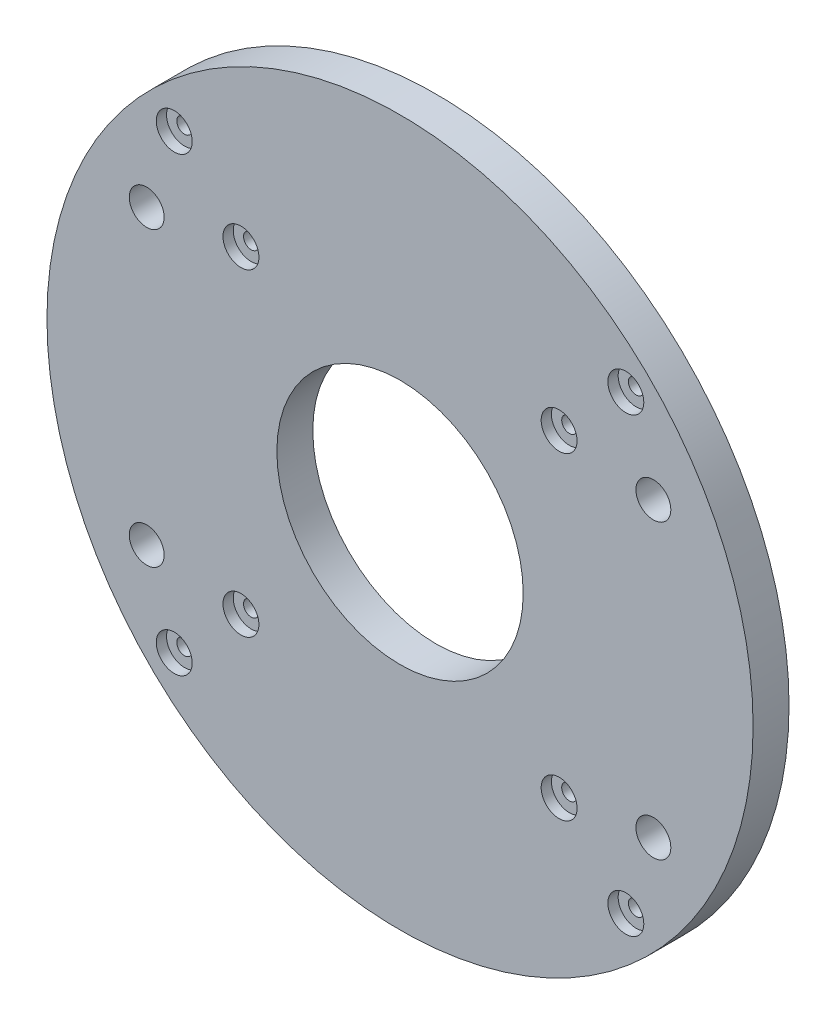
ISO-10303-21;
HEADER;
FILE_DESCRIPTION(('STEP AP214'),'2;1');
FILE_NAME('part.step','',(''),(''),'','','');
FILE_SCHEMA(('AUTOMOTIVE_DESIGN { 1 0 10303 214 1 1 1 1 }'));
ENDSEC;
DATA;
#1=APPLICATION_CONTEXT('core data for automotive mechanical design processes');
#2=APPLICATION_PROTOCOL_DEFINITION('international standard','automotive_design',2000,#1);
#3=PRODUCT_CONTEXT('',#1,'mechanical');
#4=PRODUCT('Part','Part','',(#3));
#5=PRODUCT_RELATED_PRODUCT_CATEGORY('part','',(#4));
#6=PRODUCT_DEFINITION_FORMATION('','',#4);
#7=PRODUCT_DEFINITION_CONTEXT('part definition',#1,'design');
#8=PRODUCT_DEFINITION('design','',#6,#7);
#9=PRODUCT_DEFINITION_SHAPE('','',#8);
#10=(LENGTH_UNIT() NAMED_UNIT(*) SI_UNIT(.MILLI.,.METRE.));
#11=(NAMED_UNIT(*) PLANE_ANGLE_UNIT() SI_UNIT($,.RADIAN.));
#12=(NAMED_UNIT(*) SI_UNIT($,.STERADIAN.) SOLID_ANGLE_UNIT());
#13=UNCERTAINTY_MEASURE_WITH_UNIT(LENGTH_MEASURE(1.E-05),#10,'distance_accuracy_value','');
#14=(GEOMETRIC_REPRESENTATION_CONTEXT(3) GLOBAL_UNCERTAINTY_ASSIGNED_CONTEXT((#13)) GLOBAL_UNIT_ASSIGNED_CONTEXT((#10,
#11,#12)) REPRESENTATION_CONTEXT('',''));
#15=CARTESIAN_POINT('',(0.,0.,0.));
#16=DIRECTION('',(0.,0.,1.));
#17=DIRECTION('',(1.,0.,0.));
#18=AXIS2_PLACEMENT_3D('',#15,#16,#17);
#19=CARTESIAN_POINT('',(53.9687161664425,14.353538626856,3.5));
#20=DIRECTION('',(0.,0.,-1.));
#21=DIRECTION('',(-1.,0.,0.));
#22=AXIS2_PLACEMENT_3D('',#19,#20,#21);
#23=CYLINDRICAL_SURFACE('',#22,0.749999999999999);
#24=CARTESIAN_POINT('',(53.9687161664425,14.353538626856,0.));
#25=DIRECTION('',(0.,0.,1.));
#26=DIRECTION('',(1.,0.,0.));
#27=AXIS2_PLACEMENT_3D('',#24,#25,#26);
#28=CIRCLE('',#27,0.749999999999999);
#29=CARTESIAN_POINT('',(54.7187161664425,14.353538626856,0.));
#30=VERTEX_POINT('',#29);
#31=EDGE_CURVE('E120',#30,#30,#28,.F.);
#32=ORIENTED_EDGE('',*,*,#31,.T.);
#33=EDGE_LOOP('',(#32));
#34=FACE_BOUND('',#33,.T.);
#35=CARTESIAN_POINT('',(53.9687161664425,14.353538626856,2.5));
#36=DIRECTION('',(0.,0.,1.));
#37=DIRECTION('',(1.,0.,0.));
#38=AXIS2_PLACEMENT_3D('',#35,#36,#37);
#39=CIRCLE('',#38,0.749999999999999);
#40=CARTESIAN_POINT('',(54.7187161664425,14.353538626856,2.5));
#41=VERTEX_POINT('',#40);
#42=EDGE_CURVE('E111',#41,#41,#39,.F.);
#43=ORIENTED_EDGE('',*,*,#42,.F.);
#44=EDGE_LOOP('',(#43));
#45=FACE_BOUND('',#44,.T.);
#46=ADVANCED_FACE('F41',(#34,#45),#23,.F.);
#47=CARTESIAN_POINT('',(47.4687161664425,-23.146461373144,3.5));
#48=DIRECTION('',(0.,0.,-1.));
#49=DIRECTION('',(-1.,0.,0.));
#50=AXIS2_PLACEMENT_3D('',#47,#48,#49);
#51=CYLINDRICAL_SURFACE('',#50,0.750000000000023);
#52=CARTESIAN_POINT('',(47.4687161664425,-23.146461373144,0.));
#53=DIRECTION('',(0.,0.,1.));
#54=DIRECTION('',(1.,0.,0.));
#55=AXIS2_PLACEMENT_3D('',#52,#53,#54);
#56=CIRCLE('',#55,0.750000000000023);
#57=CARTESIAN_POINT('',(48.2187161664425,-23.146461373144,0.));
#58=VERTEX_POINT('',#57);
#59=EDGE_CURVE('E145',#58,#58,#56,.T.);
#60=ORIENTED_EDGE('',*,*,#59,.F.);
#61=EDGE_LOOP('',(#60));
#62=FACE_BOUND('',#61,.T.);
#63=CARTESIAN_POINT('',(47.4687161664425,-23.146461373144,2.5));
#64=DIRECTION('',(0.,0.,1.));
#65=DIRECTION('',(1.,0.,0.));
#66=AXIS2_PLACEMENT_3D('',#63,#64,#65);
#67=CIRCLE('',#66,0.750000000000023);
#68=CARTESIAN_POINT('',(48.2187161664425,-23.146461373144,2.5));
#69=VERTEX_POINT('',#68);
#70=EDGE_CURVE('E101',#69,#69,#67,.F.);
#71=ORIENTED_EDGE('',*,*,#70,.F.);
#72=EDGE_LOOP('',(#71));
#73=FACE_BOUND('',#72,.T.);
#74=ADVANCED_FACE('F204',(#62,#73),#51,.F.);
#75=CARTESIAN_POINT('',(53.9687161664425,-29.646461373144,3.5));
#76=DIRECTION('',(0.,0.,-1.));
#77=DIRECTION('',(-1.,0.,0.));
#78=AXIS2_PLACEMENT_3D('',#75,#76,#77);
#79=CYLINDRICAL_SURFACE('',#78,0.750000000000049);
#80=CARTESIAN_POINT('',(53.9687161664425,-29.646461373144,0.));
#81=DIRECTION('',(0.,0.,1.));
#82=DIRECTION('',(1.,0.,0.));
#83=AXIS2_PLACEMENT_3D('',#80,#81,#82);
#84=CIRCLE('',#83,0.750000000000049);
#85=CARTESIAN_POINT('',(54.7187161664426,-29.646461373144,0.));
#86=VERTEX_POINT('',#85);
#87=EDGE_CURVE('E148',#86,#86,#84,.T.);
#88=ORIENTED_EDGE('',*,*,#87,.F.);
#89=EDGE_LOOP('',(#88));
#90=FACE_BOUND('',#89,.T.);
#91=CARTESIAN_POINT('',(53.9687161664425,-29.646461373144,2.5));
#92=DIRECTION('',(0.,0.,1.));
#93=DIRECTION('',(1.,0.,0.));
#94=AXIS2_PLACEMENT_3D('',#91,#92,#93);
#95=CIRCLE('',#94,0.750000000000049);
#96=CARTESIAN_POINT('',(54.7187161664426,-29.646461373144,2.5));
#97=VERTEX_POINT('',#96);
#98=EDGE_CURVE('E119',#97,#97,#95,.F.);
#99=ORIENTED_EDGE('',*,*,#98,.F.);
#100=EDGE_LOOP('',(#99));
#101=FACE_BOUND('',#100,.T.);
#102=ADVANCED_FACE('F361',(#90,#101),#79,.F.);
#103=CARTESIAN_POINT('',(9.96871616644252,-29.646461373144,3.5));
#104=DIRECTION('',(0.,0.,-1.));
#105=DIRECTION('',(-1.,0.,0.));
#106=AXIS2_PLACEMENT_3D('',#103,#104,#105);
#107=CYLINDRICAL_SURFACE('',#106,0.750000000000032);
#108=CARTESIAN_POINT('',(9.96871616644252,-29.646461373144,0.));
#109=DIRECTION('',(0.,0.,1.));
#110=DIRECTION('',(1.,0.,0.));
#111=AXIS2_PLACEMENT_3D('',#108,#109,#110);
#112=CIRCLE('',#111,0.750000000000032);
#113=CARTESIAN_POINT('',(10.7187161664425,-29.646461373144,0.));
#114=VERTEX_POINT('',#113);
#115=EDGE_CURVE('E151',#114,#114,#112,.F.);
#116=ORIENTED_EDGE('',*,*,#115,.T.);
#117=EDGE_LOOP('',(#116));
#118=FACE_BOUND('',#117,.T.);
#119=CARTESIAN_POINT('',(9.96871616644252,-29.646461373144,2.5));
#120=DIRECTION('',(0.,0.,1.));
#121=DIRECTION('',(1.,0.,0.));
#122=AXIS2_PLACEMENT_3D('',#119,#120,#121);
#123=CIRCLE('',#122,0.750000000000032);
#124=CARTESIAN_POINT('',(10.7187161664425,-29.646461373144,2.5));
#125=VERTEX_POINT('',#124);
#126=EDGE_CURVE('E129',#125,#125,#123,.F.);
#127=ORIENTED_EDGE('',*,*,#126,.F.);
#128=EDGE_LOOP('',(#127));
#129=FACE_BOUND('',#128,.T.);
#130=ADVANCED_FACE('F357',(#118,#129),#107,.F.);
#131=CARTESIAN_POINT('',(47.4687161664425,7.85353862685598,3.5));
#132=DIRECTION('',(0.,0.,-1.));
#133=DIRECTION('',(-1.,0.,0.));
#134=AXIS2_PLACEMENT_3D('',#131,#132,#133);
#135=CYLINDRICAL_SURFACE('',#134,0.749999999999999);
#136=CARTESIAN_POINT('',(47.4687161664425,7.85353862685598,0.));
#137=DIRECTION('',(0.,0.,1.));
#138=DIRECTION('',(1.,0.,0.));
#139=AXIS2_PLACEMENT_3D('',#136,#137,#138);
#140=CIRCLE('',#139,0.749999999999999);
#141=CARTESIAN_POINT('',(48.2187161664425,7.85353862685598,0.));
#142=VERTEX_POINT('',#141);
#143=EDGE_CURVE('E154',#142,#142,#140,.F.);
#144=ORIENTED_EDGE('',*,*,#143,.T.);
#145=EDGE_LOOP('',(#144));
#146=FACE_BOUND('',#145,.T.);
#147=CARTESIAN_POINT('',(47.4687161664425,7.85353862685598,2.5));
#148=DIRECTION('',(0.,0.,1.));
#149=DIRECTION('',(1.,0.,0.));
#150=AXIS2_PLACEMENT_3D('',#147,#148,#149);
#151=CIRCLE('',#150,0.749999999999999);
#152=CARTESIAN_POINT('',(48.2187161664425,7.85353862685598,2.5));
#153=VERTEX_POINT('',#152);
#154=EDGE_CURVE('E83',#153,#153,#151,.F.);
#155=ORIENTED_EDGE('',*,*,#154,.F.);
#156=EDGE_LOOP('',(#155));
#157=FACE_BOUND('',#156,.T.);
#158=ADVANCED_FACE('F360',(#146,#157),#135,.F.);
#159=CARTESIAN_POINT('',(9.96871616644252,14.353538626856,3.5));
#160=DIRECTION('',(0.,0.,-1.));
#161=DIRECTION('',(-1.,0.,0.));
#162=AXIS2_PLACEMENT_3D('',#159,#160,#161);
#163=CYLINDRICAL_SURFACE('',#162,0.749999999999975);
#164=CARTESIAN_POINT('',(9.96871616644252,14.353538626856,0.));
#165=DIRECTION('',(0.,0.,1.));
#166=DIRECTION('',(1.,0.,0.));
#167=AXIS2_PLACEMENT_3D('',#164,#165,#166);
#168=CIRCLE('',#167,0.749999999999975);
#169=CARTESIAN_POINT('',(10.7187161664425,14.353538626856,0.));
#170=VERTEX_POINT('',#169);
#171=EDGE_CURVE('E157',#170,#170,#168,.T.);
#172=ORIENTED_EDGE('',*,*,#171,.F.);
#173=EDGE_LOOP('',(#172));
#174=FACE_BOUND('',#173,.T.);
#175=CARTESIAN_POINT('',(9.96871616644252,14.353538626856,2.5));
#176=DIRECTION('',(0.,0.,1.));
#177=DIRECTION('',(1.,0.,0.));
#178=AXIS2_PLACEMENT_3D('',#175,#176,#177);
#179=CIRCLE('',#178,0.749999999999975);
#180=CARTESIAN_POINT('',(10.7187161664425,14.353538626856,2.5));
#181=VERTEX_POINT('',#180);
#182=EDGE_CURVE('E74',#181,#181,#179,.F.);
#183=ORIENTED_EDGE('',*,*,#182,.F.);
#184=EDGE_LOOP('',(#183));
#185=FACE_BOUND('',#184,.T.);
#186=ADVANCED_FACE('F370',(#174,#185),#163,.F.);
#187=CARTESIAN_POINT('',(16.4687161664425,7.85353862685598,3.5));
#188=DIRECTION('',(0.,0.,-1.));
#189=DIRECTION('',(-1.,0.,0.));
#190=AXIS2_PLACEMENT_3D('',#187,#188,#189);
#191=CYLINDRICAL_SURFACE('',#190,0.749999999999959);
#192=CARTESIAN_POINT('',(16.4687161664425,7.85353862685598,0.));
#193=DIRECTION('',(0.,0.,1.));
#194=DIRECTION('',(1.,0.,0.));
#195=AXIS2_PLACEMENT_3D('',#192,#193,#194);
#196=CIRCLE('',#195,0.749999999999959);
#197=CARTESIAN_POINT('',(17.2187161664425,7.85353862685598,0.));
#198=VERTEX_POINT('',#197);
#199=EDGE_CURVE('E160',#198,#198,#196,.T.);
#200=ORIENTED_EDGE('',*,*,#199,.F.);
#201=EDGE_LOOP('',(#200));
#202=FACE_BOUND('',#201,.T.);
#203=CARTESIAN_POINT('',(16.4687161664425,7.85353862685598,2.5));
#204=DIRECTION('',(0.,0.,1.));
#205=DIRECTION('',(1.,0.,0.));
#206=AXIS2_PLACEMENT_3D('',#203,#204,#205);
#207=CIRCLE('',#206,0.749999999999959);
#208=CARTESIAN_POINT('',(17.2187161664425,7.85353862685598,2.5));
#209=VERTEX_POINT('',#208);
#210=EDGE_CURVE('E93',#209,#209,#207,.F.);
#211=ORIENTED_EDGE('',*,*,#210,.F.);
#212=EDGE_LOOP('',(#211));
#213=FACE_BOUND('',#212,.T.);
#214=ADVANCED_FACE('F294',(#202,#213),#191,.F.);
#215=CARTESIAN_POINT('',(16.4687161664425,-23.146461373144,3.5));
#216=DIRECTION('',(0.,0.,-1.));
#217=DIRECTION('',(-1.,0.,0.));
#218=AXIS2_PLACEMENT_3D('',#215,#216,#217);
#219=CYLINDRICAL_SURFACE('',#218,0.749999999999987);
#220=CARTESIAN_POINT('',(16.4687161664425,-23.146461373144,0.));
#221=DIRECTION('',(0.,0.,1.));
#222=DIRECTION('',(1.,0.,0.));
#223=AXIS2_PLACEMENT_3D('',#220,#221,#222);
#224=CIRCLE('',#223,0.749999999999987);
#225=CARTESIAN_POINT('',(17.2187161664425,-23.146461373144,0.));
#226=VERTEX_POINT('',#225);
#227=EDGE_CURVE('E163',#226,#226,#224,.F.);
#228=ORIENTED_EDGE('',*,*,#227,.T.);
#229=EDGE_LOOP('',(#228));
#230=FACE_BOUND('',#229,.T.);
#231=CARTESIAN_POINT('',(16.4687161664425,-23.146461373144,2.5));
#232=DIRECTION('',(0.,0.,1.));
#233=DIRECTION('',(1.,0.,0.));
#234=AXIS2_PLACEMENT_3D('',#231,#232,#233);
#235=CIRCLE('',#234,0.749999999999987);
#236=CARTESIAN_POINT('',(17.2187161664425,-23.146461373144,2.5));
#237=VERTEX_POINT('',#236);
#238=EDGE_CURVE('E138',#237,#237,#235,.F.);
#239=ORIENTED_EDGE('',*,*,#238,.F.);
#240=EDGE_LOOP('',(#239));
#241=FACE_BOUND('',#240,.T.);
#242=ADVANCED_FACE('F223',(#230,#241),#219,.F.);
#243=CARTESIAN_POINT('',(31.9687161664425,-7.64646137314402,3.5));
#244=DIRECTION('',(0.,0.,1.));
#245=DIRECTION('',(1.,0.,0.));
#246=AXIS2_PLACEMENT_3D('',#243,#244,#245);
#247=PLANE('',#246);
#248=CARTESIAN_POINT('',(47.4687161664425,-23.146461373144,3.5));
#249=DIRECTION('',(0.,0.,1.));
#250=DIRECTION('',(1.,0.,0.));
#251=AXIS2_PLACEMENT_3D('',#248,#249,#250);
#252=CIRCLE('',#251,1.75000000000002);
#253=CARTESIAN_POINT('',(49.2187161664425,-23.146461373144,3.5));
#254=VERTEX_POINT('',#253);
#255=EDGE_CURVE('E98',#254,#254,#252,.T.);
#256=ORIENTED_EDGE('',*,*,#255,.F.);
#257=EDGE_LOOP('',(#256));
#258=FACE_BOUND('',#257,.T.);
#259=CARTESIAN_POINT('',(53.9687161664425,14.353538626856,3.5));
#260=DIRECTION('',(0.,0.,1.));
#261=DIRECTION('',(1.,0.,0.));
#262=AXIS2_PLACEMENT_3D('',#259,#260,#261);
#263=CIRCLE('',#262,1.75);
#264=CARTESIAN_POINT('',(55.7187161664425,14.353538626856,3.5));
#265=VERTEX_POINT('',#264);
#266=EDGE_CURVE('E106',#265,#265,#263,.T.);
#267=ORIENTED_EDGE('',*,*,#266,.F.);
#268=EDGE_LOOP('',(#267));
#269=FACE_BOUND('',#268,.T.);
#270=CARTESIAN_POINT('',(47.4687161664425,7.85353862685598,3.5));
#271=DIRECTION('',(0.,0.,1.));
#272=DIRECTION('',(1.,0.,0.));
#273=AXIS2_PLACEMENT_3D('',#270,#271,#272);
#274=CIRCLE('',#273,1.75);
#275=CARTESIAN_POINT('',(49.2187161664425,7.85353862685598,3.5));
#276=VERTEX_POINT('',#275);
#277=EDGE_CURVE('E80',#276,#276,#274,.T.);
#278=ORIENTED_EDGE('',*,*,#277,.F.);
#279=EDGE_LOOP('',(#278));
#280=FACE_BOUND('',#279,.T.);
#281=CARTESIAN_POINT('',(16.4687161664425,7.85353862685598,3.5));
#282=DIRECTION('',(0.,0.,1.));
#283=DIRECTION('',(1.,0.,0.));
#284=AXIS2_PLACEMENT_3D('',#281,#282,#283);
#285=CIRCLE('',#284,1.74999999999996);
#286=CARTESIAN_POINT('',(18.2187161664425,7.85353862685598,3.5));
#287=VERTEX_POINT('',#286);
#288=EDGE_CURVE('E88',#287,#287,#285,.T.);
#289=ORIENTED_EDGE('',*,*,#288,.F.);
#290=EDGE_LOOP('',(#289));
#291=FACE_BOUND('',#290,.T.);
#292=CARTESIAN_POINT('',(16.4687161664425,-23.146461373144,3.5));
#293=DIRECTION('',(0.,0.,1.));
#294=DIRECTION('',(1.,0.,0.));
#295=AXIS2_PLACEMENT_3D('',#292,#293,#294);
#296=CIRCLE('',#295,1.74999999999999);
#297=CARTESIAN_POINT('',(18.2187161664425,-23.146461373144,3.5));
#298=VERTEX_POINT('',#297);
#299=EDGE_CURVE('E133',#298,#298,#296,.T.);
#300=ORIENTED_EDGE('',*,*,#299,.F.);
#301=EDGE_LOOP('',(#300));
#302=FACE_BOUND('',#301,.T.);
#303=CARTESIAN_POINT('',(9.96871616644252,-29.646461373144,3.5));
#304=DIRECTION('',(0.,0.,1.));
#305=DIRECTION('',(1.,0.,0.));
#306=AXIS2_PLACEMENT_3D('',#303,#304,#305);
#307=CIRCLE('',#306,1.75000000000003);
#308=CARTESIAN_POINT('',(11.7187161664425,-29.646461373144,3.5));
#309=VERTEX_POINT('',#308);
#310=EDGE_CURVE('E124',#309,#309,#307,.T.);
#311=ORIENTED_EDGE('',*,*,#310,.F.);
#312=EDGE_LOOP('',(#311));
#313=FACE_BOUND('',#312,.T.);
#314=CARTESIAN_POINT('',(53.9687161664425,-29.646461373144,3.5));
#315=DIRECTION('',(0.,0.,1.));
#316=DIRECTION('',(1.,0.,0.));
#317=AXIS2_PLACEMENT_3D('',#314,#315,#316);
#318=CIRCLE('',#317,1.75000000000005);
#319=CARTESIAN_POINT('',(55.7187161664426,-29.646461373144,3.5));
#320=VERTEX_POINT('',#319);
#321=EDGE_CURVE('E116',#320,#320,#318,.T.);
#322=ORIENTED_EDGE('',*,*,#321,.F.);
#323=EDGE_LOOP('',(#322));
#324=FACE_BOUND('',#323,.T.);
#325=CARTESIAN_POINT('',(9.96871616644252,14.353538626856,3.5));
#326=DIRECTION('',(0.,0.,1.));
#327=DIRECTION('',(1.,0.,0.));
#328=AXIS2_PLACEMENT_3D('',#325,#326,#327);
#329=CIRCLE('',#328,1.74999999999997);
#330=CARTESIAN_POINT('',(11.7187161664425,14.353538626856,3.5));
#331=VERTEX_POINT('',#330);
#332=EDGE_CURVE('E71',#331,#331,#329,.T.);
#333=ORIENTED_EDGE('',*,*,#332,.F.);
#334=EDGE_LOOP('',(#333));
#335=FACE_BOUND('',#334,.T.);
#336=CARTESIAN_POINT('',(31.9687161664425,-7.64646137314402,3.5));
#337=DIRECTION('',(0.,0.,1.));
#338=DIRECTION('',(1.,0.,0.));
#339=AXIS2_PLACEMENT_3D('',#336,#337,#338);
#340=CIRCLE('',#339,12.);
#341=CARTESIAN_POINT('',(43.9687161664425,-7.64646137314402,3.5));
#342=VERTEX_POINT('',#341);
#343=EDGE_CURVE('E67',#342,#342,#340,.T.);
#344=ORIENTED_EDGE('',*,*,#343,.F.);
#345=EDGE_LOOP('',(#344));
#346=FACE_BOUND('',#345,.T.);
#347=CARTESIAN_POINT('',(7.286992158586,-21.896461373144,3.5));
#348=DIRECTION('',(0.,0.,1.));
#349=DIRECTION('',(1.,0.,0.));
#350=AXIS2_PLACEMENT_3D('',#347,#348,#349);
#351=CIRCLE('',#350,1.69999999999999);
#352=CARTESIAN_POINT('',(8.98699215858599,-21.896461373144,3.5));
#353=VERTEX_POINT('',#352);
#354=EDGE_CURVE('E61',#353,#353,#351,.T.);
#355=ORIENTED_EDGE('',*,*,#354,.F.);
#356=EDGE_LOOP('',(#355));
#357=FACE_BOUND('',#356,.T.);
#358=CARTESIAN_POINT('',(7.286992158586,6.60353862685598,3.5));
#359=DIRECTION('',(0.,0.,1.));
#360=DIRECTION('',(1.,0.,0.));
#361=AXIS2_PLACEMENT_3D('',#358,#359,#360);
#362=CIRCLE('',#361,1.7);
#363=CARTESIAN_POINT('',(8.986992158586,6.60353862685598,3.5));
#364=VERTEX_POINT('',#363);
#365=EDGE_CURVE('E54',#364,#364,#362,.T.);
#366=ORIENTED_EDGE('',*,*,#365,.F.);
#367=EDGE_LOOP('',(#366));
#368=FACE_BOUND('',#367,.T.);
#369=CARTESIAN_POINT('',(31.9687161664425,-7.64646137314402,3.5));
#370=DIRECTION('',(0.,0.,1.));
#371=DIRECTION('',(1.,0.,0.));
#372=AXIS2_PLACEMENT_3D('',#369,#370,#371);
#373=CIRCLE('',#372,34.4);
#374=CARTESIAN_POINT('',(66.3687161664425,-7.64646137314402,3.5));
#375=VERTEX_POINT('',#374);
#376=EDGE_CURVE('E10',#375,#375,#373,.T.);
#377=ORIENTED_EDGE('',*,*,#376,.T.);
#378=EDGE_LOOP('',(#377));
#379=FACE_BOUND('',#378,.T.);
#380=CARTESIAN_POINT('',(56.650440174299,6.60353862685598,3.5));
#381=DIRECTION('',(0.,0.,1.));
#382=DIRECTION('',(1.,0.,0.));
#383=AXIS2_PLACEMENT_3D('',#380,#381,#382);
#384=CIRCLE('',#383,1.7);
#385=CARTESIAN_POINT('',(58.350440174299,6.60353862685598,3.5));
#386=VERTEX_POINT('',#385);
#387=EDGE_CURVE('E58',#386,#386,#384,.T.);
#388=ORIENTED_EDGE('',*,*,#387,.F.);
#389=EDGE_LOOP('',(#388));
#390=FACE_BOUND('',#389,.T.);
#391=CARTESIAN_POINT('',(56.650440174299,-21.896461373144,3.5));
#392=DIRECTION('',(0.,0.,1.));
#393=DIRECTION('',(1.,0.,0.));
#394=AXIS2_PLACEMENT_3D('',#391,#392,#393);
#395=CIRCLE('',#394,1.69999999999999);
#396=CARTESIAN_POINT('',(58.350440174299,-21.896461373144,3.5));
#397=VERTEX_POINT('',#396);
#398=EDGE_CURVE('E64',#397,#397,#395,.T.);
#399=ORIENTED_EDGE('',*,*,#398,.F.);
#400=EDGE_LOOP('',(#399));
#401=FACE_BOUND('',#400,.T.);
#402=ADVANCED_FACE('F188',(#258,#269,#280,#291,#302,#313,#324,#335,#346,#357,#368,#379,#390,
#401),#247,.T.);
#403=CARTESIAN_POINT('',(31.9687161664425,-7.64646137314402,0.));
#404=DIRECTION('',(0.,0.,1.));
#405=DIRECTION('',(1.,0.,0.));
#406=AXIS2_PLACEMENT_3D('',#403,#404,#405);
#407=PLANE('',#406);
#408=CARTESIAN_POINT('',(31.9687161664425,-7.64646137314402,0.));
#409=DIRECTION('',(0.,0.,1.));
#410=DIRECTION('',(1.,0.,0.));
#411=AXIS2_PLACEMENT_3D('',#408,#409,#410);
#412=CIRCLE('',#411,34.4);
#413=CARTESIAN_POINT('',(66.3687161664425,-7.64646137314402,0.));
#414=VERTEX_POINT('',#413);
#415=EDGE_CURVE('E49',#414,#414,#412,.T.);
#416=ORIENTED_EDGE('',*,*,#415,.F.);
#417=EDGE_LOOP('',(#416));
#418=FACE_BOUND('',#417,.T.);
#419=ORIENTED_EDGE('',*,*,#115,.F.);
#420=EDGE_LOOP('',(#419));
#421=FACE_BOUND('',#420,.T.);
#422=ORIENTED_EDGE('',*,*,#227,.F.);
#423=EDGE_LOOP('',(#422));
#424=FACE_BOUND('',#423,.T.);
#425=CARTESIAN_POINT('',(7.286992158586,6.60353862685598,0.));
#426=DIRECTION('',(0.,0.,1.));
#427=DIRECTION('',(1.,0.,0.));
#428=AXIS2_PLACEMENT_3D('',#425,#426,#427);
#429=CIRCLE('',#428,1.7);
#430=CARTESIAN_POINT('',(8.986992158586,6.60353862685598,0.));
#431=VERTEX_POINT('',#430);
#432=EDGE_CURVE('E166',#431,#431,#429,.T.);
#433=ORIENTED_EDGE('',*,*,#432,.T.);
#434=EDGE_LOOP('',(#433));
#435=FACE_BOUND('',#434,.T.);
#436=CARTESIAN_POINT('',(56.650440174299,6.60353862685598,0.));
#437=DIRECTION('',(0.,0.,1.));
#438=DIRECTION('',(1.,0.,0.));
#439=AXIS2_PLACEMENT_3D('',#436,#437,#438);
#440=CIRCLE('',#439,1.7);
#441=CARTESIAN_POINT('',(58.350440174299,6.60353862685598,0.));
#442=VERTEX_POINT('',#441);
#443=EDGE_CURVE('E169',#442,#442,#440,.T.);
#444=ORIENTED_EDGE('',*,*,#443,.T.);
#445=EDGE_LOOP('',(#444));
#446=FACE_BOUND('',#445,.T.);
#447=CARTESIAN_POINT('',(7.286992158586,-21.896461373144,0.));
#448=DIRECTION('',(0.,0.,1.));
#449=DIRECTION('',(1.,0.,0.));
#450=AXIS2_PLACEMENT_3D('',#447,#448,#449);
#451=CIRCLE('',#450,1.69999999999999);
#452=CARTESIAN_POINT('',(8.98699215858599,-21.896461373144,0.));
#453=VERTEX_POINT('',#452);
#454=EDGE_CURVE('E172',#453,#453,#451,.T.);
#455=ORIENTED_EDGE('',*,*,#454,.T.);
#456=EDGE_LOOP('',(#455));
#457=FACE_BOUND('',#456,.T.);
#458=CARTESIAN_POINT('',(56.650440174299,-21.896461373144,0.));
#459=DIRECTION('',(0.,0.,1.));
#460=DIRECTION('',(1.,0.,0.));
#461=AXIS2_PLACEMENT_3D('',#458,#459,#460);
#462=CIRCLE('',#461,1.69999999999999);
#463=CARTESIAN_POINT('',(58.350440174299,-21.896461373144,0.));
#464=VERTEX_POINT('',#463);
#465=EDGE_CURVE('E175',#464,#464,#462,.T.);
#466=ORIENTED_EDGE('',*,*,#465,.T.);
#467=EDGE_LOOP('',(#466));
#468=FACE_BOUND('',#467,.T.);
#469=CARTESIAN_POINT('',(31.9687161664425,-7.64646137314402,0.));
#470=DIRECTION('',(0.,0.,1.));
#471=DIRECTION('',(1.,0.,0.));
#472=AXIS2_PLACEMENT_3D('',#469,#470,#471);
#473=CIRCLE('',#472,12.);
#474=CARTESIAN_POINT('',(43.9687161664425,-7.64646137314402,0.));
#475=VERTEX_POINT('',#474);
#476=EDGE_CURVE('E45',#475,#475,#473,.F.);
#477=ORIENTED_EDGE('',*,*,#476,.F.);
#478=EDGE_LOOP('',(#477));
#479=FACE_BOUND('',#478,.T.);
#480=ORIENTED_EDGE('',*,*,#199,.T.);
#481=EDGE_LOOP('',(#480));
#482=FACE_BOUND('',#481,.T.);
#483=ORIENTED_EDGE('',*,*,#171,.T.);
#484=EDGE_LOOP('',(#483));
#485=FACE_BOUND('',#484,.T.);
#486=ORIENTED_EDGE('',*,*,#143,.F.);
#487=EDGE_LOOP('',(#486));
#488=FACE_BOUND('',#487,.T.);
#489=ORIENTED_EDGE('',*,*,#87,.T.);
#490=EDGE_LOOP('',(#489));
#491=FACE_BOUND('',#490,.T.);
#492=ORIENTED_EDGE('',*,*,#59,.T.);
#493=EDGE_LOOP('',(#492));
#494=FACE_BOUND('',#493,.T.);
#495=ORIENTED_EDGE('',*,*,#31,.F.);
#496=EDGE_LOOP('',(#495));
#497=FACE_BOUND('',#496,.T.);
#498=ADVANCED_FACE('F185',(#418,#421,#424,#435,#446,#457,#468,#479,#482,#485,#488,#491,#494,
#497),#407,.F.);
#499=CARTESIAN_POINT('',(31.9687161664425,-7.64646137314402,3.5));
#500=DIRECTION('',(0.,0.,-1.));
#501=DIRECTION('',(-1.,0.,0.));
#502=AXIS2_PLACEMENT_3D('',#499,#500,#501);
#503=CYLINDRICAL_SURFACE('',#502,34.4);
#504=ORIENTED_EDGE('',*,*,#415,.T.);
#505=EDGE_LOOP('',(#504));
#506=FACE_BOUND('',#505,.T.);
#507=ORIENTED_EDGE('',*,*,#376,.F.);
#508=EDGE_LOOP('',(#507));
#509=FACE_BOUND('',#508,.T.);
#510=ADVANCED_FACE('F43',(#506,#509),#503,.T.);
#511=CARTESIAN_POINT('',(7.286992158586,6.60353862685598,3.5));
#512=DIRECTION('',(0.,0.,-1.));
#513=DIRECTION('',(-1.,0.,0.));
#514=AXIS2_PLACEMENT_3D('',#511,#512,#513);
#515=CYLINDRICAL_SURFACE('',#514,1.7);
#516=ORIENTED_EDGE('',*,*,#432,.F.);
#517=EDGE_LOOP('',(#516));
#518=FACE_BOUND('',#517,.T.);
#519=ORIENTED_EDGE('',*,*,#365,.T.);
#520=EDGE_LOOP('',(#519));
#521=FACE_BOUND('',#520,.T.);
#522=ADVANCED_FACE('F266',(#518,#521),#515,.F.);
#523=CARTESIAN_POINT('',(56.650440174299,6.60353862685598,3.5));
#524=DIRECTION('',(0.,0.,-1.));
#525=DIRECTION('',(-1.,0.,0.));
#526=AXIS2_PLACEMENT_3D('',#523,#524,#525);
#527=CYLINDRICAL_SURFACE('',#526,1.7);
#528=ORIENTED_EDGE('',*,*,#443,.F.);
#529=EDGE_LOOP('',(#528));
#530=FACE_BOUND('',#529,.T.);
#531=ORIENTED_EDGE('',*,*,#387,.T.);
#532=EDGE_LOOP('',(#531));
#533=FACE_BOUND('',#532,.T.);
#534=ADVANCED_FACE('F259',(#530,#533),#527,.F.);
#535=CARTESIAN_POINT('',(7.286992158586,-21.896461373144,3.5));
#536=DIRECTION('',(0.,0.,-1.));
#537=DIRECTION('',(-1.,0.,0.));
#538=AXIS2_PLACEMENT_3D('',#535,#536,#537);
#539=CYLINDRICAL_SURFACE('',#538,1.69999999999999);
#540=ORIENTED_EDGE('',*,*,#454,.F.);
#541=EDGE_LOOP('',(#540));
#542=FACE_BOUND('',#541,.T.);
#543=ORIENTED_EDGE('',*,*,#354,.T.);
#544=EDGE_LOOP('',(#543));
#545=FACE_BOUND('',#544,.T.);
#546=ADVANCED_FACE('F250',(#542,#545),#539,.F.);
#547=CARTESIAN_POINT('',(56.650440174299,-21.896461373144,3.5));
#548=DIRECTION('',(0.,0.,-1.));
#549=DIRECTION('',(-1.,0.,0.));
#550=AXIS2_PLACEMENT_3D('',#547,#548,#549);
#551=CYLINDRICAL_SURFACE('',#550,1.69999999999999);
#552=ORIENTED_EDGE('',*,*,#465,.F.);
#553=EDGE_LOOP('',(#552));
#554=FACE_BOUND('',#553,.T.);
#555=ORIENTED_EDGE('',*,*,#398,.T.);
#556=EDGE_LOOP('',(#555));
#557=FACE_BOUND('',#556,.T.);
#558=ADVANCED_FACE('F248',(#554,#557),#551,.F.);
#559=CARTESIAN_POINT('',(31.9687161664425,-7.64646137314402,-3.));
#560=DIRECTION('',(0.,0.,1.));
#561=DIRECTION('',(1.,0.,0.));
#562=AXIS2_PLACEMENT_3D('',#559,#560,#561);
#563=CYLINDRICAL_SURFACE('',#562,12.);
#564=ORIENTED_EDGE('',*,*,#476,.T.);
#565=EDGE_LOOP('',(#564));
#566=FACE_BOUND('',#565,.T.);
#567=ORIENTED_EDGE('',*,*,#343,.T.);
#568=EDGE_LOOP('',(#567));
#569=FACE_BOUND('',#568,.T.);
#570=ADVANCED_FACE('F182',(#566,#569),#563,.F.);
#571=CARTESIAN_POINT('',(16.4687161664425,-23.146461373144,2.5));
#572=DIRECTION('',(0.,0.,1.));
#573=DIRECTION('',(1.,0.,0.));
#574=AXIS2_PLACEMENT_3D('',#571,#572,#573);
#575=CYLINDRICAL_SURFACE('',#574,1.74999999999999);
#576=CARTESIAN_POINT('',(16.4687161664425,-23.146461373144,2.5));
#577=DIRECTION('',(0.,0.,1.));
#578=DIRECTION('',(1.,0.,0.));
#579=AXIS2_PLACEMENT_3D('',#576,#577,#578);
#580=CIRCLE('',#579,1.74999999999999);
#581=CARTESIAN_POINT('',(18.2187161664425,-23.146461373144,2.5));
#582=VERTEX_POINT('',#581);
#583=EDGE_CURVE('E102',#582,#582,#580,.T.);
#584=ORIENTED_EDGE('',*,*,#583,.F.);
#585=EDGE_LOOP('',(#584));
#586=FACE_BOUND('',#585,.T.);
#587=ORIENTED_EDGE('',*,*,#299,.T.);
#588=EDGE_LOOP('',(#587));
#589=FACE_BOUND('',#588,.T.);
#590=ADVANCED_FACE('F257',(#586,#589),#575,.F.);
#591=CARTESIAN_POINT('',(0.,0.,2.5));
#592=DIRECTION('',(0.,0.,1.));
#593=DIRECTION('',(1.,0.,0.));
#594=AXIS2_PLACEMENT_3D('',#591,#592,#593);
#595=PLANE('',#594);
#596=ORIENTED_EDGE('',*,*,#238,.T.);
#597=EDGE_LOOP('',(#596));
#598=FACE_BOUND('',#597,.T.);
#599=ORIENTED_EDGE('',*,*,#583,.T.);
#600=EDGE_LOOP('',(#599));
#601=FACE_BOUND('',#600,.T.);
#602=ADVANCED_FACE('F298',(#598,#601),#595,.T.);
#603=CARTESIAN_POINT('',(16.4687161664425,7.85353862685598,2.5));
#604=DIRECTION('',(0.,0.,1.));
#605=DIRECTION('',(1.,0.,0.));
#606=AXIS2_PLACEMENT_3D('',#603,#604,#605);
#607=CYLINDRICAL_SURFACE('',#606,1.74999999999996);
#608=CARTESIAN_POINT('',(16.4687161664425,7.85353862685598,2.5));
#609=DIRECTION('',(0.,0.,1.));
#610=DIRECTION('',(1.,0.,0.));
#611=AXIS2_PLACEMENT_3D('',#608,#609,#610);
#612=CIRCLE('',#611,1.74999999999996);
#613=CARTESIAN_POINT('',(18.2187161664425,7.85353862685598,2.5));
#614=VERTEX_POINT('',#613);
#615=EDGE_CURVE('E75',#614,#614,#612,.T.);
#616=ORIENTED_EDGE('',*,*,#615,.F.);
#617=EDGE_LOOP('',(#616));
#618=FACE_BOUND('',#617,.T.);
#619=ORIENTED_EDGE('',*,*,#288,.T.);
#620=EDGE_LOOP('',(#619));
#621=FACE_BOUND('',#620,.T.);
#622=ADVANCED_FACE('F301',(#618,#621),#607,.F.);
#623=CARTESIAN_POINT('',(0.,0.,2.5));
#624=DIRECTION('',(0.,0.,1.));
#625=DIRECTION('',(1.,0.,0.));
#626=AXIS2_PLACEMENT_3D('',#623,#624,#625);
#627=PLANE('',#626);
#628=ORIENTED_EDGE('',*,*,#210,.T.);
#629=EDGE_LOOP('',(#628));
#630=FACE_BOUND('',#629,.T.);
#631=ORIENTED_EDGE('',*,*,#615,.T.);
#632=EDGE_LOOP('',(#631));
#633=FACE_BOUND('',#632,.T.);
#634=ADVANCED_FACE('F335',(#630,#633),#627,.T.);
#635=CARTESIAN_POINT('',(9.96871616644252,14.353538626856,2.5));
#636=DIRECTION('',(0.,0.,1.));
#637=DIRECTION('',(1.,0.,0.));
#638=AXIS2_PLACEMENT_3D('',#635,#636,#637);
#639=CYLINDRICAL_SURFACE('',#638,1.74999999999997);
#640=CARTESIAN_POINT('',(9.96871616644252,14.353538626856,2.5));
#641=DIRECTION('',(0.,0.,1.));
#642=DIRECTION('',(1.,0.,0.));
#643=AXIS2_PLACEMENT_3D('',#640,#641,#642);
#644=CIRCLE('',#643,1.74999999999997);
#645=CARTESIAN_POINT('',(11.7187161664425,14.353538626856,2.5));
#646=VERTEX_POINT('',#645);
#647=EDGE_CURVE('E70',#646,#646,#644,.T.);
#648=ORIENTED_EDGE('',*,*,#647,.F.);
#649=EDGE_LOOP('',(#648));
#650=FACE_BOUND('',#649,.T.);
#651=ORIENTED_EDGE('',*,*,#332,.T.);
#652=EDGE_LOOP('',(#651));
#653=FACE_BOUND('',#652,.T.);
#654=ADVANCED_FACE('F338',(#650,#653),#639,.F.);
#655=CARTESIAN_POINT('',(0.,0.,2.5));
#656=DIRECTION('',(0.,0.,1.));
#657=DIRECTION('',(1.,0.,0.));
#658=AXIS2_PLACEMENT_3D('',#655,#656,#657);
#659=PLANE('',#658);
#660=ORIENTED_EDGE('',*,*,#182,.T.);
#661=EDGE_LOOP('',(#660));
#662=FACE_BOUND('',#661,.T.);
#663=ORIENTED_EDGE('',*,*,#647,.T.);
#664=EDGE_LOOP('',(#663));
#665=FACE_BOUND('',#664,.T.);
#666=ADVANCED_FACE('F349',(#662,#665),#659,.T.);
#667=CARTESIAN_POINT('',(47.4687161664425,7.85353862685598,2.5));
#668=DIRECTION('',(0.,0.,1.));
#669=DIRECTION('',(1.,0.,0.));
#670=AXIS2_PLACEMENT_3D('',#667,#668,#669);
#671=CYLINDRICAL_SURFACE('',#670,1.75);
#672=CARTESIAN_POINT('',(47.4687161664425,7.85353862685598,2.5));
#673=DIRECTION('',(0.,0.,1.));
#674=DIRECTION('',(1.,0.,0.));
#675=AXIS2_PLACEMENT_3D('',#672,#673,#674);
#676=CIRCLE('',#675,1.75);
#677=CARTESIAN_POINT('',(49.2187161664425,7.85353862685598,2.5));
#678=VERTEX_POINT('',#677);
#679=EDGE_CURVE('E85',#678,#678,#676,.T.);
#680=ORIENTED_EDGE('',*,*,#679,.F.);
#681=EDGE_LOOP('',(#680));
#682=FACE_BOUND('',#681,.T.);
#683=ORIENTED_EDGE('',*,*,#277,.T.);
#684=EDGE_LOOP('',(#683));
#685=FACE_BOUND('',#684,.T.);
#686=ADVANCED_FACE('F345',(#682,#685),#671,.F.);
#687=CARTESIAN_POINT('',(0.,0.,2.5));
#688=DIRECTION('',(0.,0.,1.));
#689=DIRECTION('',(1.,0.,0.));
#690=AXIS2_PLACEMENT_3D('',#687,#688,#689);
#691=PLANE('',#690);
#692=ORIENTED_EDGE('',*,*,#154,.T.);
#693=EDGE_LOOP('',(#692));
#694=FACE_BOUND('',#693,.T.);
#695=ORIENTED_EDGE('',*,*,#679,.T.);
#696=EDGE_LOOP('',(#695));
#697=FACE_BOUND('',#696,.T.);
#698=ADVANCED_FACE('F319',(#694,#697),#691,.T.);
#699=CARTESIAN_POINT('',(9.96871616644252,-29.646461373144,2.5));
#700=DIRECTION('',(0.,0.,1.));
#701=DIRECTION('',(1.,0.,0.));
#702=AXIS2_PLACEMENT_3D('',#699,#700,#701);
#703=CYLINDRICAL_SURFACE('',#702,1.75000000000003);
#704=CARTESIAN_POINT('',(9.96871616644252,-29.646461373144,2.5));
#705=DIRECTION('',(0.,0.,1.));
#706=DIRECTION('',(1.,0.,0.));
#707=AXIS2_PLACEMENT_3D('',#704,#705,#706);
#708=CIRCLE('',#707,1.75000000000003);
#709=CARTESIAN_POINT('',(11.7187161664425,-29.646461373144,2.5));
#710=VERTEX_POINT('',#709);
#711=EDGE_CURVE('E130',#710,#710,#708,.T.);
#712=ORIENTED_EDGE('',*,*,#711,.F.);
#713=EDGE_LOOP('',(#712));
#714=FACE_BOUND('',#713,.T.);
#715=ORIENTED_EDGE('',*,*,#310,.T.);
#716=EDGE_LOOP('',(#715));
#717=FACE_BOUND('',#716,.T.);
#718=ADVANCED_FACE('F315',(#714,#717),#703,.F.);
#719=CARTESIAN_POINT('',(0.,0.,2.5));
#720=DIRECTION('',(0.,0.,1.));
#721=DIRECTION('',(1.,0.,0.));
#722=AXIS2_PLACEMENT_3D('',#719,#720,#721);
#723=PLANE('',#722);
#724=ORIENTED_EDGE('',*,*,#126,.T.);
#725=EDGE_LOOP('',(#724));
#726=FACE_BOUND('',#725,.T.);
#727=ORIENTED_EDGE('',*,*,#711,.T.);
#728=EDGE_LOOP('',(#727));
#729=FACE_BOUND('',#728,.T.);
#730=ADVANCED_FACE('F311',(#726,#729),#723,.T.);
#731=CARTESIAN_POINT('',(53.9687161664425,-29.646461373144,2.5));
#732=DIRECTION('',(0.,0.,1.));
#733=DIRECTION('',(1.,0.,0.));
#734=AXIS2_PLACEMENT_3D('',#731,#732,#733);
#735=CYLINDRICAL_SURFACE('',#734,1.75000000000005);
#736=CARTESIAN_POINT('',(53.9687161664425,-29.646461373144,2.5));
#737=DIRECTION('',(0.,0.,1.));
#738=DIRECTION('',(1.,0.,0.));
#739=AXIS2_PLACEMENT_3D('',#736,#737,#738);
#740=CIRCLE('',#739,1.75000000000005);
#741=CARTESIAN_POINT('',(55.7187161664426,-29.646461373144,2.5));
#742=VERTEX_POINT('',#741);
#743=EDGE_CURVE('E121',#742,#742,#740,.T.);
#744=ORIENTED_EDGE('',*,*,#743,.F.);
#745=EDGE_LOOP('',(#744));
#746=FACE_BOUND('',#745,.T.);
#747=ORIENTED_EDGE('',*,*,#321,.T.);
#748=EDGE_LOOP('',(#747));
#749=FACE_BOUND('',#748,.T.);
#750=ADVANCED_FACE('F314',(#746,#749),#735,.F.);
#751=CARTESIAN_POINT('',(0.,0.,2.5));
#752=DIRECTION('',(0.,0.,1.));
#753=DIRECTION('',(1.,0.,0.));
#754=AXIS2_PLACEMENT_3D('',#751,#752,#753);
#755=PLANE('',#754);
#756=ORIENTED_EDGE('',*,*,#98,.T.);
#757=EDGE_LOOP('',(#756));
#758=FACE_BOUND('',#757,.T.);
#759=ORIENTED_EDGE('',*,*,#743,.T.);
#760=EDGE_LOOP('',(#759));
#761=FACE_BOUND('',#760,.T.);
#762=ADVANCED_FACE('F321',(#758,#761),#755,.T.);
#763=CARTESIAN_POINT('',(47.4687161664425,-23.146461373144,2.5));
#764=DIRECTION('',(0.,0.,1.));
#765=DIRECTION('',(1.,0.,0.));
#766=AXIS2_PLACEMENT_3D('',#763,#764,#765);
#767=CYLINDRICAL_SURFACE('',#766,1.75000000000002);
#768=CARTESIAN_POINT('',(47.4687161664425,-23.146461373144,2.5));
#769=DIRECTION('',(0.,0.,1.));
#770=DIRECTION('',(1.,0.,0.));
#771=AXIS2_PLACEMENT_3D('',#768,#769,#770);
#772=CIRCLE('',#771,1.75000000000002);
#773=CARTESIAN_POINT('',(49.2187161664425,-23.146461373144,2.5));
#774=VERTEX_POINT('',#773);
#775=EDGE_CURVE('E103',#774,#774,#772,.T.);
#776=ORIENTED_EDGE('',*,*,#775,.F.);
#777=EDGE_LOOP('',(#776));
#778=FACE_BOUND('',#777,.T.);
#779=ORIENTED_EDGE('',*,*,#255,.T.);
#780=EDGE_LOOP('',(#779));
#781=FACE_BOUND('',#780,.T.);
#782=ADVANCED_FACE('F324',(#778,#781),#767,.F.);
#783=CARTESIAN_POINT('',(0.,0.,2.5));
#784=DIRECTION('',(0.,0.,1.));
#785=DIRECTION('',(1.,0.,0.));
#786=AXIS2_PLACEMENT_3D('',#783,#784,#785);
#787=PLANE('',#786);
#788=ORIENTED_EDGE('',*,*,#70,.T.);
#789=EDGE_LOOP('',(#788));
#790=FACE_BOUND('',#789,.T.);
#791=ORIENTED_EDGE('',*,*,#775,.T.);
#792=EDGE_LOOP('',(#791));
#793=FACE_BOUND('',#792,.T.);
#794=ADVANCED_FACE('F217',(#790,#793),#787,.T.);
#795=CARTESIAN_POINT('',(53.9687161664425,14.353538626856,2.5));
#796=DIRECTION('',(0.,0.,1.));
#797=DIRECTION('',(1.,0.,0.));
#798=AXIS2_PLACEMENT_3D('',#795,#796,#797);
#799=CYLINDRICAL_SURFACE('',#798,1.75);
#800=CARTESIAN_POINT('',(53.9687161664425,14.353538626856,2.5));
#801=DIRECTION('',(0.,0.,1.));
#802=DIRECTION('',(1.,0.,0.));
#803=AXIS2_PLACEMENT_3D('',#800,#801,#802);
#804=CIRCLE('',#803,1.75);
#805=CARTESIAN_POINT('',(55.7187161664425,14.353538626856,2.5));
#806=VERTEX_POINT('',#805);
#807=EDGE_CURVE('E84',#806,#806,#804,.T.);
#808=ORIENTED_EDGE('',*,*,#807,.F.);
#809=EDGE_LOOP('',(#808));
#810=FACE_BOUND('',#809,.T.);
#811=ORIENTED_EDGE('',*,*,#266,.T.);
#812=EDGE_LOOP('',(#811));
#813=FACE_BOUND('',#812,.T.);
#814=ADVANCED_FACE('F211',(#810,#813),#799,.F.);
#815=CARTESIAN_POINT('',(0.,0.,2.5));
#816=DIRECTION('',(0.,0.,1.));
#817=DIRECTION('',(1.,0.,0.));
#818=AXIS2_PLACEMENT_3D('',#815,#816,#817);
#819=PLANE('',#818);
#820=ORIENTED_EDGE('',*,*,#42,.T.);
#821=EDGE_LOOP('',(#820));
#822=FACE_BOUND('',#821,.T.);
#823=ORIENTED_EDGE('',*,*,#807,.T.);
#824=EDGE_LOOP('',(#823));
#825=FACE_BOUND('',#824,.T.);
#826=ADVANCED_FACE('F208',(#822,#825),#819,.T.);
#827=CLOSED_SHELL('',(#46,#74,#102,#130,#158,#186,#214,#242,#402,#498,#510,#522,#534,#546,#558,
#570,#590,#602,#622,#634,#654,#666,#686,#698,#718,#730,#750,#762,#782,#794,#814,#826));
#828=MANIFOLD_SOLID_BREP('B2',#827);
#829=ADVANCED_BREP_SHAPE_REPRESENTATION('',(#18,#828),#14);
#830=SHAPE_DEFINITION_REPRESENTATION(#9,#829);
ENDSEC;
END-ISO-10303-21;
